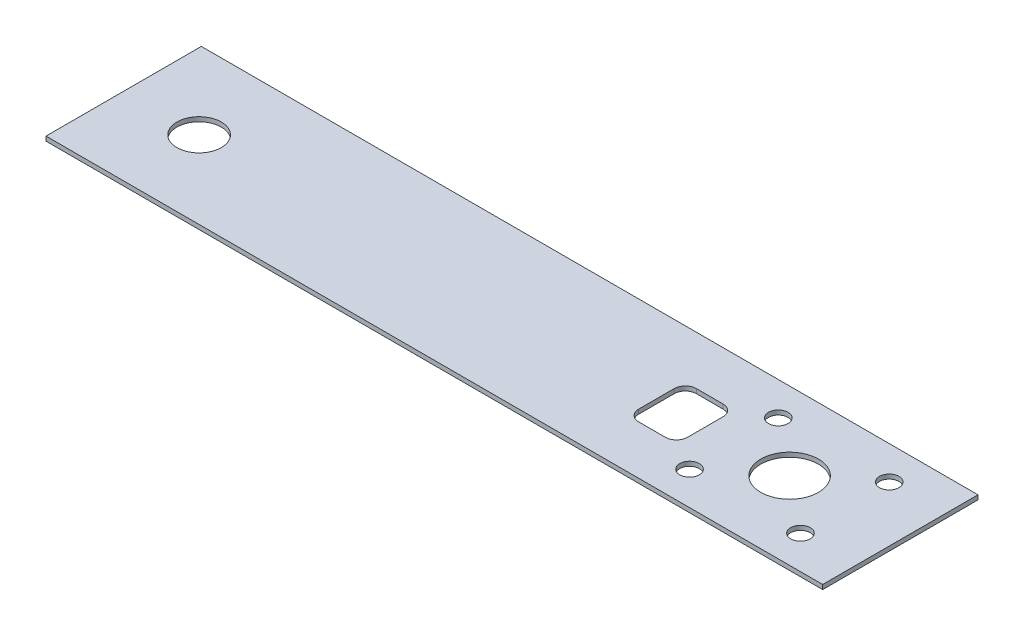
ISO-10303-21;
HEADER;
FILE_DESCRIPTION(('STEP AP214'),'2;1');
FILE_NAME('part.step','',(''),(''),'','','');
FILE_SCHEMA(('AUTOMOTIVE_DESIGN { 1 0 10303 214 1 1 1 1 }'));
ENDSEC;
DATA;
#1=APPLICATION_CONTEXT('core data for automotive mechanical design processes');
#2=APPLICATION_PROTOCOL_DEFINITION('international standard','automotive_design',2000,#1);
#3=PRODUCT_CONTEXT('',#1,'mechanical');
#4=PRODUCT('Part','Part','',(#3));
#5=PRODUCT_RELATED_PRODUCT_CATEGORY('part','',(#4));
#6=PRODUCT_DEFINITION_FORMATION('','',#4);
#7=PRODUCT_DEFINITION_CONTEXT('part definition',#1,'design');
#8=PRODUCT_DEFINITION('design','',#6,#7);
#9=PRODUCT_DEFINITION_SHAPE('','',#8);
#10=(LENGTH_UNIT() NAMED_UNIT(*) SI_UNIT(.MILLI.,.METRE.));
#11=(NAMED_UNIT(*) PLANE_ANGLE_UNIT() SI_UNIT($,.RADIAN.));
#12=(NAMED_UNIT(*) SI_UNIT($,.STERADIAN.) SOLID_ANGLE_UNIT());
#13=UNCERTAINTY_MEASURE_WITH_UNIT(LENGTH_MEASURE(1.E-05),#10,'distance_accuracy_value','');
#14=(GEOMETRIC_REPRESENTATION_CONTEXT(3) GLOBAL_UNCERTAINTY_ASSIGNED_CONTEXT((#13)) GLOBAL_UNIT_ASSIGNED_CONTEXT((#10,
#11,#12)) REPRESENTATION_CONTEXT('',''));
#15=CARTESIAN_POINT('',(0.,0.,0.));
#16=DIRECTION('',(0.,0.,1.));
#17=DIRECTION('',(1.,0.,0.));
#18=AXIS2_PLACEMENT_3D('',#15,#16,#17);
#19=CARTESIAN_POINT('',(0.,2.,0.));
#20=DIRECTION('',(0.,-1.,0.));
#21=DIRECTION('',(0.,0.,-1.));
#22=AXIS2_PLACEMENT_3D('',#19,#20,#21);
#23=PLANE('',#22);
#24=CARTESIAN_POINT('',(-141.,2.,0.));
#25=DIRECTION('',(0.,-1.,0.));
#26=DIRECTION('',(0.,0.,-1.));
#27=AXIS2_PLACEMENT_3D('',#24,#25,#26);
#28=CIRCLE('',#27,10.);
#29=CARTESIAN_POINT('',(-141.,2.,-10.));
#30=VERTEX_POINT('',#29);
#31=EDGE_CURVE('E321',#30,#30,#28,.T.);
#32=ORIENTED_EDGE('',*,*,#31,.T.);
#33=EDGE_LOOP('',(#32));
#34=FACE_BOUND('',#33,.T.);
#35=CARTESIAN_POINT('',(125.1,2.,0.));
#36=DIRECTION('',(0.,-1.,0.));
#37=DIRECTION('',(0.,0.,-1.));
#38=AXIS2_PLACEMENT_3D('',#35,#36,#37);
#39=CIRCLE('',#38,13.);
#40=CARTESIAN_POINT('',(125.1,2.,-13.));
#41=VERTEX_POINT('',#40);
#42=EDGE_CURVE('E313',#41,#41,#39,.T.);
#43=ORIENTED_EDGE('',*,*,#42,.T.);
#44=EDGE_LOOP('',(#43));
#45=FACE_BOUND('',#44,.T.);
#46=CARTESIAN_POINT('',(100.,2.,-20.0000000000135));
#47=DIRECTION('',(0.,1.,0.));
#48=DIRECTION('',(0.,0.,-1.));
#49=AXIS2_PLACEMENT_3D('',#46,#47,#48);
#50=CIRCLE('',#49,4.40000000000002);
#51=CARTESIAN_POINT('',(100.,2.,-24.4000000000135));
#52=VERTEX_POINT('',#51);
#53=EDGE_CURVE('E269',#52,#52,#50,.T.);
#54=ORIENTED_EDGE('',*,*,#53,.F.);
#55=EDGE_LOOP('',(#54));
#56=FACE_BOUND('',#55,.T.);
#57=CARTESIAN_POINT('',(100.,2.,19.9999999999872));
#58=DIRECTION('',(0.,1.,0.));
#59=DIRECTION('',(0.,0.,1.));
#60=AXIS2_PLACEMENT_3D('',#57,#58,#59);
#61=CIRCLE('',#60,4.40000000000002);
#62=CARTESIAN_POINT('',(100.,2.,24.3999999999873));
#63=VERTEX_POINT('',#62);
#64=EDGE_CURVE('E261',#63,#63,#61,.T.);
#65=ORIENTED_EDGE('',*,*,#64,.F.);
#66=EDGE_LOOP('',(#65));
#67=FACE_BOUND('',#66,.T.);
#68=CARTESIAN_POINT('',(150.,2.,19.9999999999872));
#69=DIRECTION('',(0.,1.,0.));
#70=DIRECTION('',(0.,0.,-1.));
#71=AXIS2_PLACEMENT_3D('',#68,#69,#70);
#72=CIRCLE('',#71,4.40000000000002);
#73=CARTESIAN_POINT('',(150.,2.,15.5999999999872));
#74=VERTEX_POINT('',#73);
#75=EDGE_CURVE('E260',#74,#74,#72,.T.);
#76=ORIENTED_EDGE('',*,*,#75,.F.);
#77=EDGE_LOOP('',(#76));
#78=FACE_BOUND('',#77,.T.);
#79=CARTESIAN_POINT('',(150.,2.,-20.0000000000135));
#80=DIRECTION('',(0.,1.,0.));
#81=DIRECTION('',(0.,0.,1.));
#82=AXIS2_PLACEMENT_3D('',#79,#80,#81);
#83=CIRCLE('',#82,4.40000000000002);
#84=CARTESIAN_POINT('',(150.,2.,-15.6000000000135));
#85=VERTEX_POINT('',#84);
#86=EDGE_CURVE('E207',#85,#85,#83,.T.);
#87=ORIENTED_EDGE('',*,*,#86,.F.);
#88=EDGE_LOOP('',(#87));
#89=FACE_BOUND('',#88,.T.);
#90=DIRECTION('',(0.,0.,-1.));
#91=VECTOR('',#90,1.);
#92=CARTESIAN_POINT('',(175.,2.,35.));
#93=LINE('',#92,#91);
#94=CARTESIAN_POINT('',(175.,2.,35.));
#95=VERTEX_POINT('',#94);
#96=CARTESIAN_POINT('',(175.,2.,-35.));
#97=VERTEX_POINT('',#96);
#98=EDGE_CURVE('E213',#95,#97,#93,.T.);
#99=ORIENTED_EDGE('',*,*,#98,.T.);
#100=DIRECTION('',(-1.,0.,0.));
#101=VECTOR('',#100,1.);
#102=CARTESIAN_POINT('',(-175.,2.,-35.));
#103=LINE('',#102,#101);
#104=CARTESIAN_POINT('',(-175.,2.,-35.));
#105=VERTEX_POINT('',#104);
#106=EDGE_CURVE('E241',#97,#105,#103,.T.);
#107=ORIENTED_EDGE('',*,*,#106,.T.);
#108=DIRECTION('',(0.,0.,1.));
#109=VECTOR('',#108,1.);
#110=CARTESIAN_POINT('',(-175.,2.,35.));
#111=LINE('',#110,#109);
#112=CARTESIAN_POINT('',(-175.,2.,35.));
#113=VERTEX_POINT('',#112);
#114=EDGE_CURVE('E200',#105,#113,#111,.T.);
#115=ORIENTED_EDGE('',*,*,#114,.T.);
#116=DIRECTION('',(1.,0.,0.));
#117=VECTOR('',#116,1.);
#118=CARTESIAN_POINT('',(-175.,2.,35.));
#119=LINE('',#118,#117);
#120=EDGE_CURVE('E195',#113,#95,#119,.T.);
#121=ORIENTED_EDGE('',*,*,#120,.T.);
#122=EDGE_LOOP('',(#99,#107,#115,#121));
#123=FACE_BOUND('',#122,.T.);
#124=CARTESIAN_POINT('',(70.0999999999999,2.,8.00000000001254));
#125=DIRECTION('',(0.,1.,0.));
#126=DIRECTION('',(0.,0.,-1.));
#127=AXIS2_PLACEMENT_3D('',#124,#125,#126);
#128=CIRCLE('',#127,5.);
#129=CARTESIAN_POINT('',(65.0999999999999,2.,8.0000000000125));
#130=VERTEX_POINT('',#129);
#131=CARTESIAN_POINT('',(70.0999999999999,2.,13.0000000000125));
#132=VERTEX_POINT('',#131);
#133=EDGE_CURVE('E135',#130,#132,#128,.T.);
#134=ORIENTED_EDGE('',*,*,#133,.F.);
#135=DIRECTION('',(0.,0.,1.));
#136=VECTOR('',#135,1.);
#137=CARTESIAN_POINT('',(65.0999999999999,2.,8.0000000000125));
#138=LINE('',#137,#136);
#139=CARTESIAN_POINT('',(65.0999999999999,2.,-8.0000000000125));
#140=VERTEX_POINT('',#139);
#141=EDGE_CURVE('E185',#140,#130,#138,.T.);
#142=ORIENTED_EDGE('',*,*,#141,.F.);
#143=CARTESIAN_POINT('',(70.0999999999999,2.,-8.00000000001254));
#144=DIRECTION('',(0.,1.,0.));
#145=DIRECTION('',(0.,0.,1.));
#146=AXIS2_PLACEMENT_3D('',#143,#144,#145);
#147=CIRCLE('',#146,5.);
#148=CARTESIAN_POINT('',(70.0999999999999,2.,-13.0000000000125));
#149=VERTEX_POINT('',#148);
#150=EDGE_CURVE('E181',#149,#140,#147,.T.);
#151=ORIENTED_EDGE('',*,*,#150,.F.);
#152=DIRECTION('',(-1.,0.,0.));
#153=VECTOR('',#152,1.);
#154=CARTESIAN_POINT('',(82.1000000000001,2.,-13.0000000000125));
#155=LINE('',#154,#153);
#156=CARTESIAN_POINT('',(82.1000000000001,2.,-13.0000000000125));
#157=VERTEX_POINT('',#156);
#158=EDGE_CURVE('E177',#157,#149,#155,.T.);
#159=ORIENTED_EDGE('',*,*,#158,.F.);
#160=CARTESIAN_POINT('',(82.1000000000001,2.,-8.00000000001254));
#161=DIRECTION('',(0.,1.,0.));
#162=DIRECTION('',(0.,0.,1.));
#163=AXIS2_PLACEMENT_3D('',#160,#161,#162);
#164=CIRCLE('',#163,5.);
#165=CARTESIAN_POINT('',(87.1000000000001,2.,-8.0000000000125));
#166=VERTEX_POINT('',#165);
#167=EDGE_CURVE('E174',#166,#157,#164,.T.);
#168=ORIENTED_EDGE('',*,*,#167,.F.);
#169=DIRECTION('',(0.,0.,-1.));
#170=VECTOR('',#169,1.);
#171=CARTESIAN_POINT('',(87.1000000000001,2.,8.0000000000125));
#172=LINE('',#171,#170);
#173=CARTESIAN_POINT('',(87.1000000000001,2.,8.00000000001251));
#174=VERTEX_POINT('',#173);
#175=EDGE_CURVE('E160',#174,#166,#172,.T.);
#176=ORIENTED_EDGE('',*,*,#175,.F.);
#177=CARTESIAN_POINT('',(82.1000000000001,2.,8.00000000001254));
#178=DIRECTION('',(0.,1.,0.));
#179=DIRECTION('',(0.,0.,1.));
#180=AXIS2_PLACEMENT_3D('',#177,#178,#179);
#181=CIRCLE('',#180,5.);
#182=CARTESIAN_POINT('',(82.1000000000001,2.,13.0000000000125));
#183=VERTEX_POINT('',#182);
#184=EDGE_CURVE('E157',#183,#174,#181,.T.);
#185=ORIENTED_EDGE('',*,*,#184,.F.);
#186=DIRECTION('',(1.,0.,0.));
#187=VECTOR('',#186,1.);
#188=CARTESIAN_POINT('',(82.1000000000001,2.,13.0000000000125));
#189=LINE('',#188,#187);
#190=EDGE_CURVE('E144',#132,#183,#189,.T.);
#191=ORIENTED_EDGE('',*,*,#190,.F.);
#192=EDGE_LOOP('',(#134,#142,#151,#159,#168,#176,#185,#191));
#193=FACE_BOUND('',#192,.T.);
#194=ADVANCED_FACE('F46',(#34,#45,#56,#67,#78,#89,#123,#193),#23,.F.);
#195=CARTESIAN_POINT('',(0.,0.,0.));
#196=DIRECTION('',(0.,-1.,0.));
#197=DIRECTION('',(0.,0.,-1.));
#198=AXIS2_PLACEMENT_3D('',#195,#196,#197);
#199=PLANE('',#198);
#200=CARTESIAN_POINT('',(-141.,0.,0.));
#201=DIRECTION('',(0.,1.,0.));
#202=DIRECTION('',(0.,0.,1.));
#203=AXIS2_PLACEMENT_3D('',#200,#201,#202);
#204=CIRCLE('',#203,10.);
#205=CARTESIAN_POINT('',(-141.,0.,10.));
#206=VERTEX_POINT('',#205);
#207=EDGE_CURVE('E319',#206,#206,#204,.T.);
#208=ORIENTED_EDGE('',*,*,#207,.T.);
#209=EDGE_LOOP('',(#208));
#210=FACE_BOUND('',#209,.T.);
#211=CARTESIAN_POINT('',(125.1,0.,0.));
#212=DIRECTION('',(0.,1.,0.));
#213=DIRECTION('',(0.,0.,1.));
#214=AXIS2_PLACEMENT_3D('',#211,#212,#213);
#215=CIRCLE('',#214,13.);
#216=CARTESIAN_POINT('',(125.1,0.,13.));
#217=VERTEX_POINT('',#216);
#218=EDGE_CURVE('E310',#217,#217,#215,.T.);
#219=ORIENTED_EDGE('',*,*,#218,.T.);
#220=EDGE_LOOP('',(#219));
#221=FACE_BOUND('',#220,.T.);
#222=CARTESIAN_POINT('',(100.,0.,19.9999999999872));
#223=DIRECTION('',(0.,1.,0.));
#224=DIRECTION('',(0.,0.,1.));
#225=AXIS2_PLACEMENT_3D('',#222,#223,#224);
#226=CIRCLE('',#225,4.40000000000002);
#227=CARTESIAN_POINT('',(100.,0.,24.3999999999873));
#228=VERTEX_POINT('',#227);
#229=EDGE_CURVE('E266',#228,#228,#226,.T.);
#230=ORIENTED_EDGE('',*,*,#229,.T.);
#231=EDGE_LOOP('',(#230));
#232=FACE_BOUND('',#231,.T.);
#233=CARTESIAN_POINT('',(150.,0.,-20.0000000000135));
#234=DIRECTION('',(0.,1.,0.));
#235=DIRECTION('',(0.,0.,1.));
#236=AXIS2_PLACEMENT_3D('',#233,#234,#235);
#237=CIRCLE('',#236,4.40000000000002);
#238=CARTESIAN_POINT('',(150.,0.,-15.6000000000135));
#239=VERTEX_POINT('',#238);
#240=EDGE_CURVE('E247',#239,#239,#237,.T.);
#241=ORIENTED_EDGE('',*,*,#240,.T.);
#242=EDGE_LOOP('',(#241));
#243=FACE_BOUND('',#242,.T.);
#244=DIRECTION('',(0.,0.,-1.));
#245=VECTOR('',#244,1.);
#246=CARTESIAN_POINT('',(175.,0.,35.));
#247=LINE('',#246,#245);
#248=CARTESIAN_POINT('',(175.,0.,35.));
#249=VERTEX_POINT('',#248);
#250=CARTESIAN_POINT('',(175.,0.,-35.));
#251=VERTEX_POINT('',#250);
#252=EDGE_CURVE('E203',#249,#251,#247,.T.);
#253=ORIENTED_EDGE('',*,*,#252,.F.);
#254=DIRECTION('',(1.,0.,0.));
#255=VECTOR('',#254,1.);
#256=CARTESIAN_POINT('',(-175.,0.,35.));
#257=LINE('',#256,#255);
#258=CARTESIAN_POINT('',(-175.,0.,35.));
#259=VERTEX_POINT('',#258);
#260=EDGE_CURVE('E211',#259,#249,#257,.T.);
#261=ORIENTED_EDGE('',*,*,#260,.F.);
#262=DIRECTION('',(0.,0.,1.));
#263=VECTOR('',#262,1.);
#264=CARTESIAN_POINT('',(-175.,0.,35.));
#265=LINE('',#264,#263);
#266=CARTESIAN_POINT('',(-175.,0.,-35.));
#267=VERTEX_POINT('',#266);
#268=EDGE_CURVE('E209',#267,#259,#265,.T.);
#269=ORIENTED_EDGE('',*,*,#268,.F.);
#270=DIRECTION('',(-1.,0.,0.));
#271=VECTOR('',#270,1.);
#272=CARTESIAN_POINT('',(-175.,0.,-35.));
#273=LINE('',#272,#271);
#274=EDGE_CURVE('E206',#251,#267,#273,.T.);
#275=ORIENTED_EDGE('',*,*,#274,.F.);
#276=EDGE_LOOP('',(#253,#261,#269,#275));
#277=FACE_BOUND('',#276,.T.);
#278=CARTESIAN_POINT('',(150.,0.,19.9999999999872));
#279=DIRECTION('',(0.,1.,0.));
#280=DIRECTION('',(0.,0.,-1.));
#281=AXIS2_PLACEMENT_3D('',#278,#279,#280);
#282=CIRCLE('',#281,4.40000000000002);
#283=CARTESIAN_POINT('',(150.,0.,15.5999999999872));
#284=VERTEX_POINT('',#283);
#285=EDGE_CURVE('E258',#284,#284,#282,.T.);
#286=ORIENTED_EDGE('',*,*,#285,.T.);
#287=EDGE_LOOP('',(#286));
#288=FACE_BOUND('',#287,.T.);
#289=CARTESIAN_POINT('',(100.,0.,-20.0000000000135));
#290=DIRECTION('',(0.,1.,0.));
#291=DIRECTION('',(0.,0.,-1.));
#292=AXIS2_PLACEMENT_3D('',#289,#290,#291);
#293=CIRCLE('',#292,4.40000000000002);
#294=CARTESIAN_POINT('',(100.,0.,-24.4000000000135));
#295=VERTEX_POINT('',#294);
#296=EDGE_CURVE('E152',#295,#295,#293,.T.);
#297=ORIENTED_EDGE('',*,*,#296,.T.);
#298=EDGE_LOOP('',(#297));
#299=FACE_BOUND('',#298,.T.);
#300=DIRECTION('',(0.,0.,1.));
#301=VECTOR('',#300,1.);
#302=CARTESIAN_POINT('',(65.0999999999999,0.,8.0000000000125));
#303=LINE('',#302,#301);
#304=CARTESIAN_POINT('',(65.0999999999999,0.,-8.0000000000125));
#305=VERTEX_POINT('',#304);
#306=CARTESIAN_POINT('',(65.0999999999999,0.,8.0000000000125));
#307=VERTEX_POINT('',#306);
#308=EDGE_CURVE('E145',#305,#307,#303,.T.);
#309=ORIENTED_EDGE('',*,*,#308,.T.);
#310=CARTESIAN_POINT('',(70.0999999999999,0.,8.00000000001254));
#311=DIRECTION('',(0.,1.,0.));
#312=DIRECTION('',(0.,0.,-1.));
#313=AXIS2_PLACEMENT_3D('',#310,#311,#312);
#314=CIRCLE('',#313,5.);
#315=CARTESIAN_POINT('',(70.0999999999999,0.,13.0000000000125));
#316=VERTEX_POINT('',#315);
#317=EDGE_CURVE('E69',#307,#316,#314,.T.);
#318=ORIENTED_EDGE('',*,*,#317,.T.);
#319=DIRECTION('',(1.,0.,0.));
#320=VECTOR('',#319,1.);
#321=CARTESIAN_POINT('',(82.1000000000001,0.,13.0000000000125));
#322=LINE('',#321,#320);
#323=CARTESIAN_POINT('',(82.1000000000001,0.,13.0000000000125));
#324=VERTEX_POINT('',#323);
#325=EDGE_CURVE('E151',#316,#324,#322,.T.);
#326=ORIENTED_EDGE('',*,*,#325,.T.);
#327=CARTESIAN_POINT('',(82.1000000000001,0.,8.00000000001254));
#328=DIRECTION('',(0.,1.,0.));
#329=DIRECTION('',(0.,0.,1.));
#330=AXIS2_PLACEMENT_3D('',#327,#328,#329);
#331=CIRCLE('',#330,5.);
#332=CARTESIAN_POINT('',(87.1000000000001,0.,8.00000000001251));
#333=VERTEX_POINT('',#332);
#334=EDGE_CURVE('E307',#324,#333,#331,.T.);
#335=ORIENTED_EDGE('',*,*,#334,.T.);
#336=DIRECTION('',(0.,0.,-1.));
#337=VECTOR('',#336,1.);
#338=CARTESIAN_POINT('',(87.1000000000001,0.,8.0000000000125));
#339=LINE('',#338,#337);
#340=CARTESIAN_POINT('',(87.1000000000001,0.,-8.0000000000125));
#341=VERTEX_POINT('',#340);
#342=EDGE_CURVE('E304',#333,#341,#339,.T.);
#343=ORIENTED_EDGE('',*,*,#342,.T.);
#344=CARTESIAN_POINT('',(82.1000000000001,0.,-8.00000000001254));
#345=DIRECTION('',(0.,1.,0.));
#346=DIRECTION('',(0.,0.,1.));
#347=AXIS2_PLACEMENT_3D('',#344,#345,#346);
#348=CIRCLE('',#347,5.);
#349=CARTESIAN_POINT('',(82.1000000000001,0.,-13.0000000000125));
#350=VERTEX_POINT('',#349);
#351=EDGE_CURVE('E301',#341,#350,#348,.T.);
#352=ORIENTED_EDGE('',*,*,#351,.T.);
#353=DIRECTION('',(-1.,0.,0.));
#354=VECTOR('',#353,1.);
#355=CARTESIAN_POINT('',(82.1000000000001,0.,-13.0000000000125));
#356=LINE('',#355,#354);
#357=CARTESIAN_POINT('',(70.0999999999999,0.,-13.0000000000125));
#358=VERTEX_POINT('',#357);
#359=EDGE_CURVE('E298',#350,#358,#356,.T.);
#360=ORIENTED_EDGE('',*,*,#359,.T.);
#361=CARTESIAN_POINT('',(70.0999999999999,0.,-8.00000000001254));
#362=DIRECTION('',(0.,1.,0.));
#363=DIRECTION('',(0.,0.,1.));
#364=AXIS2_PLACEMENT_3D('',#361,#362,#363);
#365=CIRCLE('',#364,5.);
#366=EDGE_CURVE('E295',#358,#305,#365,.T.);
#367=ORIENTED_EDGE('',*,*,#366,.T.);
#368=EDGE_LOOP('',(#309,#318,#326,#335,#343,#352,#360,#367));
#369=FACE_BOUND('',#368,.T.);
#370=ADVANCED_FACE('F229',(#210,#221,#232,#243,#277,#288,#299,#369),#199,.T.);
#371=CARTESIAN_POINT('',(175.,2.,35.));
#372=DIRECTION('',(-1.,0.,0.));
#373=DIRECTION('',(0.,0.,1.));
#374=AXIS2_PLACEMENT_3D('',#371,#372,#373);
#375=PLANE('',#374);
#376=ORIENTED_EDGE('',*,*,#252,.T.);
#377=DIRECTION('',(0.,-1.,0.));
#378=VECTOR('',#377,1.);
#379=CARTESIAN_POINT('',(175.,2.,-35.));
#380=LINE('',#379,#378);
#381=EDGE_CURVE('E12',#97,#251,#380,.T.);
#382=ORIENTED_EDGE('',*,*,#381,.F.);
#383=ORIENTED_EDGE('',*,*,#98,.F.);
#384=DIRECTION('',(0.,-1.,0.));
#385=VECTOR('',#384,1.);
#386=CARTESIAN_POINT('',(175.,2.,35.));
#387=LINE('',#386,#385);
#388=EDGE_CURVE('E199',#95,#249,#387,.T.);
#389=ORIENTED_EDGE('',*,*,#388,.T.);
#390=EDGE_LOOP('',(#376,#382,#383,#389));
#391=FACE_BOUND('',#390,.T.);
#392=ADVANCED_FACE('F48',(#391),#375,.F.);
#393=CARTESIAN_POINT('',(-175.,2.,-35.));
#394=DIRECTION('',(0.,0.,1.));
#395=DIRECTION('',(1.,0.,0.));
#396=AXIS2_PLACEMENT_3D('',#393,#394,#395);
#397=PLANE('',#396);
#398=ORIENTED_EDGE('',*,*,#274,.T.);
#399=DIRECTION('',(0.,-1.,0.));
#400=VECTOR('',#399,1.);
#401=CARTESIAN_POINT('',(-175.,2.,-35.));
#402=LINE('',#401,#400);
#403=EDGE_CURVE('E54',#105,#267,#402,.T.);
#404=ORIENTED_EDGE('',*,*,#403,.F.);
#405=ORIENTED_EDGE('',*,*,#106,.F.);
#406=ORIENTED_EDGE('',*,*,#381,.T.);
#407=EDGE_LOOP('',(#398,#404,#405,#406));
#408=FACE_BOUND('',#407,.T.);
#409=ADVANCED_FACE('F364',(#408),#397,.F.);
#410=CARTESIAN_POINT('',(-175.,2.,35.));
#411=DIRECTION('',(1.,0.,0.));
#412=DIRECTION('',(0.,0.,-1.));
#413=AXIS2_PLACEMENT_3D('',#410,#411,#412);
#414=PLANE('',#413);
#415=ORIENTED_EDGE('',*,*,#268,.T.);
#416=DIRECTION('',(0.,-1.,0.));
#417=VECTOR('',#416,1.);
#418=CARTESIAN_POINT('',(-175.,2.,35.));
#419=LINE('',#418,#417);
#420=EDGE_CURVE('E216',#113,#259,#419,.T.);
#421=ORIENTED_EDGE('',*,*,#420,.F.);
#422=ORIENTED_EDGE('',*,*,#114,.F.);
#423=ORIENTED_EDGE('',*,*,#403,.T.);
#424=EDGE_LOOP('',(#415,#421,#422,#423));
#425=FACE_BOUND('',#424,.T.);
#426=ADVANCED_FACE('F223',(#425),#414,.F.);
#427=CARTESIAN_POINT('',(-175.,2.,35.));
#428=DIRECTION('',(0.,0.,-1.));
#429=DIRECTION('',(-1.,0.,0.));
#430=AXIS2_PLACEMENT_3D('',#427,#428,#429);
#431=PLANE('',#430);
#432=ORIENTED_EDGE('',*,*,#260,.T.);
#433=ORIENTED_EDGE('',*,*,#388,.F.);
#434=ORIENTED_EDGE('',*,*,#120,.F.);
#435=ORIENTED_EDGE('',*,*,#420,.T.);
#436=EDGE_LOOP('',(#432,#433,#434,#435));
#437=FACE_BOUND('',#436,.T.);
#438=ADVANCED_FACE('F233',(#437),#431,.F.);
#439=CARTESIAN_POINT('',(150.,2.,-20.0000000000135));
#440=DIRECTION('',(0.,-1.,0.));
#441=DIRECTION('',(0.,0.,-1.));
#442=AXIS2_PLACEMENT_3D('',#439,#440,#441);
#443=CYLINDRICAL_SURFACE('',#442,4.40000000000002);
#444=ORIENTED_EDGE('',*,*,#86,.T.);
#445=EDGE_LOOP('',(#444));
#446=FACE_BOUND('',#445,.T.);
#447=ORIENTED_EDGE('',*,*,#240,.F.);
#448=EDGE_LOOP('',(#447));
#449=FACE_BOUND('',#448,.T.);
#450=ADVANCED_FACE('F351',(#446,#449),#443,.F.);
#451=CARTESIAN_POINT('',(150.,2.,19.9999999999872));
#452=DIRECTION('',(0.,-1.,0.));
#453=DIRECTION('',(0.,0.,-1.));
#454=AXIS2_PLACEMENT_3D('',#451,#452,#453);
#455=CYLINDRICAL_SURFACE('',#454,4.40000000000002);
#456=ORIENTED_EDGE('',*,*,#75,.T.);
#457=EDGE_LOOP('',(#456));
#458=FACE_BOUND('',#457,.T.);
#459=ORIENTED_EDGE('',*,*,#285,.F.);
#460=EDGE_LOOP('',(#459));
#461=FACE_BOUND('',#460,.T.);
#462=ADVANCED_FACE('F354',(#458,#461),#455,.F.);
#463=CARTESIAN_POINT('',(100.,2.,19.9999999999872));
#464=DIRECTION('',(0.,-1.,0.));
#465=DIRECTION('',(0.,0.,-1.));
#466=AXIS2_PLACEMENT_3D('',#463,#464,#465);
#467=CYLINDRICAL_SURFACE('',#466,4.40000000000002);
#468=ORIENTED_EDGE('',*,*,#64,.T.);
#469=EDGE_LOOP('',(#468));
#470=FACE_BOUND('',#469,.T.);
#471=ORIENTED_EDGE('',*,*,#229,.F.);
#472=EDGE_LOOP('',(#471));
#473=FACE_BOUND('',#472,.T.);
#474=ADVANCED_FACE('F412',(#470,#473),#467,.F.);
#475=CARTESIAN_POINT('',(100.,2.,-20.0000000000135));
#476=DIRECTION('',(0.,-1.,0.));
#477=DIRECTION('',(0.,0.,-1.));
#478=AXIS2_PLACEMENT_3D('',#475,#476,#477);
#479=CYLINDRICAL_SURFACE('',#478,4.40000000000002);
#480=ORIENTED_EDGE('',*,*,#53,.T.);
#481=EDGE_LOOP('',(#480));
#482=FACE_BOUND('',#481,.T.);
#483=ORIENTED_EDGE('',*,*,#296,.F.);
#484=EDGE_LOOP('',(#483));
#485=FACE_BOUND('',#484,.T.);
#486=ADVANCED_FACE('F409',(#482,#485),#479,.F.);
#487=CARTESIAN_POINT('',(70.0999999999999,2.,8.00000000001254));
#488=DIRECTION('',(0.,-1.,0.));
#489=DIRECTION('',(0.,0.,-1.));
#490=AXIS2_PLACEMENT_3D('',#487,#488,#489);
#491=CYLINDRICAL_SURFACE('',#490,5.);
#492=ORIENTED_EDGE('',*,*,#317,.F.);
#493=DIRECTION('',(0.,-1.,0.));
#494=VECTOR('',#493,1.);
#495=CARTESIAN_POINT('',(65.0999999999999,2.,8.0000000000125));
#496=LINE('',#495,#494);
#497=EDGE_CURVE('E139',#130,#307,#496,.T.);
#498=ORIENTED_EDGE('',*,*,#497,.F.);
#499=ORIENTED_EDGE('',*,*,#133,.T.);
#500=DIRECTION('',(0.,-1.,0.));
#501=VECTOR('',#500,1.);
#502=CARTESIAN_POINT('',(70.0999999999999,2.,13.0000000000125));
#503=LINE('',#502,#501);
#504=EDGE_CURVE('E138',#132,#316,#503,.T.);
#505=ORIENTED_EDGE('',*,*,#504,.T.);
#506=EDGE_LOOP('',(#492,#498,#499,#505));
#507=FACE_BOUND('',#506,.T.);
#508=ADVANCED_FACE('F137',(#507),#491,.F.);
#509=CARTESIAN_POINT('',(82.1000000000001,2.,13.0000000000125));
#510=DIRECTION('',(0.,0.,-1.));
#511=DIRECTION('',(-1.,0.,0.));
#512=AXIS2_PLACEMENT_3D('',#509,#510,#511);
#513=PLANE('',#512);
#514=ORIENTED_EDGE('',*,*,#325,.F.);
#515=ORIENTED_EDGE('',*,*,#504,.F.);
#516=ORIENTED_EDGE('',*,*,#190,.T.);
#517=DIRECTION('',(0.,-1.,0.));
#518=VECTOR('',#517,1.);
#519=CARTESIAN_POINT('',(82.1000000000001,2.,13.0000000000125));
#520=LINE('',#519,#518);
#521=EDGE_CURVE('E153',#183,#324,#520,.T.);
#522=ORIENTED_EDGE('',*,*,#521,.T.);
#523=EDGE_LOOP('',(#514,#515,#516,#522));
#524=FACE_BOUND('',#523,.T.);
#525=ADVANCED_FACE('F148',(#524),#513,.T.);
#526=CARTESIAN_POINT('',(82.1000000000001,2.,8.00000000001254));
#527=DIRECTION('',(0.,-1.,0.));
#528=DIRECTION('',(0.,0.,-1.));
#529=AXIS2_PLACEMENT_3D('',#526,#527,#528);
#530=CYLINDRICAL_SURFACE('',#529,5.);
#531=ORIENTED_EDGE('',*,*,#334,.F.);
#532=ORIENTED_EDGE('',*,*,#521,.F.);
#533=ORIENTED_EDGE('',*,*,#184,.T.);
#534=DIRECTION('',(0.,-1.,0.));
#535=VECTOR('',#534,1.);
#536=CARTESIAN_POINT('',(87.1000000000001,2.,8.00000000001251));
#537=LINE('',#536,#535);
#538=EDGE_CURVE('E283',#174,#333,#537,.T.);
#539=ORIENTED_EDGE('',*,*,#538,.T.);
#540=EDGE_LOOP('',(#531,#532,#533,#539));
#541=FACE_BOUND('',#540,.T.);
#542=ADVANCED_FACE('F396',(#541),#530,.F.);
#543=CARTESIAN_POINT('',(87.1000000000001,2.,8.0000000000125));
#544=DIRECTION('',(-1.,0.,0.));
#545=DIRECTION('',(0.,0.,1.));
#546=AXIS2_PLACEMENT_3D('',#543,#544,#545);
#547=PLANE('',#546);
#548=ORIENTED_EDGE('',*,*,#342,.F.);
#549=ORIENTED_EDGE('',*,*,#538,.F.);
#550=ORIENTED_EDGE('',*,*,#175,.T.);
#551=DIRECTION('',(0.,-1.,0.));
#552=VECTOR('',#551,1.);
#553=CARTESIAN_POINT('',(87.1000000000001,2.,-8.0000000000125));
#554=LINE('',#553,#552);
#555=EDGE_CURVE('E285',#166,#341,#554,.T.);
#556=ORIENTED_EDGE('',*,*,#555,.T.);
#557=EDGE_LOOP('',(#548,#549,#550,#556));
#558=FACE_BOUND('',#557,.T.);
#559=ADVANCED_FACE('F379',(#558),#547,.T.);
#560=CARTESIAN_POINT('',(82.1000000000001,2.,-8.00000000001254));
#561=DIRECTION('',(0.,-1.,0.));
#562=DIRECTION('',(0.,0.,-1.));
#563=AXIS2_PLACEMENT_3D('',#560,#561,#562);
#564=CYLINDRICAL_SURFACE('',#563,5.);
#565=ORIENTED_EDGE('',*,*,#351,.F.);
#566=ORIENTED_EDGE('',*,*,#555,.F.);
#567=ORIENTED_EDGE('',*,*,#167,.T.);
#568=DIRECTION('',(0.,-1.,0.));
#569=VECTOR('',#568,1.);
#570=CARTESIAN_POINT('',(82.1000000000001,2.,-13.0000000000125));
#571=LINE('',#570,#569);
#572=EDGE_CURVE('E287',#157,#350,#571,.T.);
#573=ORIENTED_EDGE('',*,*,#572,.T.);
#574=EDGE_LOOP('',(#565,#566,#567,#573));
#575=FACE_BOUND('',#574,.T.);
#576=ADVANCED_FACE('F383',(#575),#564,.F.);
#577=CARTESIAN_POINT('',(82.1000000000001,2.,-13.0000000000125));
#578=DIRECTION('',(0.,0.,1.));
#579=DIRECTION('',(1.,0.,0.));
#580=AXIS2_PLACEMENT_3D('',#577,#578,#579);
#581=PLANE('',#580);
#582=ORIENTED_EDGE('',*,*,#359,.F.);
#583=ORIENTED_EDGE('',*,*,#572,.F.);
#584=ORIENTED_EDGE('',*,*,#158,.T.);
#585=DIRECTION('',(0.,-1.,0.));
#586=VECTOR('',#585,1.);
#587=CARTESIAN_POINT('',(70.0999999999999,2.,-13.0000000000125));
#588=LINE('',#587,#586);
#589=EDGE_CURVE('E289',#149,#358,#588,.T.);
#590=ORIENTED_EDGE('',*,*,#589,.T.);
#591=EDGE_LOOP('',(#582,#583,#584,#590));
#592=FACE_BOUND('',#591,.T.);
#593=ADVANCED_FACE('F390',(#592),#581,.T.);
#594=CARTESIAN_POINT('',(70.0999999999999,2.,-8.00000000001254));
#595=DIRECTION('',(0.,-1.,0.));
#596=DIRECTION('',(0.,0.,-1.));
#597=AXIS2_PLACEMENT_3D('',#594,#595,#596);
#598=CYLINDRICAL_SURFACE('',#597,5.);
#599=ORIENTED_EDGE('',*,*,#366,.F.);
#600=ORIENTED_EDGE('',*,*,#589,.F.);
#601=ORIENTED_EDGE('',*,*,#150,.T.);
#602=DIRECTION('',(0.,-1.,0.));
#603=VECTOR('',#602,1.);
#604=CARTESIAN_POINT('',(65.0999999999999,2.,-8.0000000000125));
#605=LINE('',#604,#603);
#606=EDGE_CURVE('E61',#140,#305,#605,.T.);
#607=ORIENTED_EDGE('',*,*,#606,.T.);
#608=EDGE_LOOP('',(#599,#600,#601,#607));
#609=FACE_BOUND('',#608,.T.);
#610=ADVANCED_FACE('F393',(#609),#598,.F.);
#611=CARTESIAN_POINT('',(65.0999999999999,2.,8.0000000000125));
#612=DIRECTION('',(1.,0.,0.));
#613=DIRECTION('',(0.,0.,-1.));
#614=AXIS2_PLACEMENT_3D('',#611,#612,#613);
#615=PLANE('',#614);
#616=ORIENTED_EDGE('',*,*,#308,.F.);
#617=ORIENTED_EDGE('',*,*,#606,.F.);
#618=ORIENTED_EDGE('',*,*,#141,.T.);
#619=ORIENTED_EDGE('',*,*,#497,.T.);
#620=EDGE_LOOP('',(#616,#617,#618,#619));
#621=FACE_BOUND('',#620,.T.);
#622=ADVANCED_FACE('F484',(#621),#615,.T.);
#623=CARTESIAN_POINT('',(125.1,2.001,0.));
#624=DIRECTION('',(0.,-1.,0.));
#625=DIRECTION('',(0.,0.,-1.));
#626=AXIS2_PLACEMENT_3D('',#623,#624,#625);
#627=CYLINDRICAL_SURFACE('',#626,13.);
#628=ORIENTED_EDGE('',*,*,#218,.F.);
#629=EDGE_LOOP('',(#628));
#630=FACE_BOUND('',#629,.T.);
#631=ORIENTED_EDGE('',*,*,#42,.F.);
#632=EDGE_LOOP('',(#631));
#633=FACE_BOUND('',#632,.T.);
#634=ADVANCED_FACE('F334',(#630,#633),#627,.F.);
#635=CARTESIAN_POINT('',(-141.,2.001,0.));
#636=DIRECTION('',(0.,-1.,0.));
#637=DIRECTION('',(0.,0.,-1.));
#638=AXIS2_PLACEMENT_3D('',#635,#636,#637);
#639=CYLINDRICAL_SURFACE('',#638,10.);
#640=ORIENTED_EDGE('',*,*,#207,.F.);
#641=EDGE_LOOP('',(#640));
#642=FACE_BOUND('',#641,.T.);
#643=ORIENTED_EDGE('',*,*,#31,.F.);
#644=EDGE_LOOP('',(#643));
#645=FACE_BOUND('',#644,.T.);
#646=ADVANCED_FACE('F331',(#642,#645),#639,.F.);
#647=CLOSED_SHELL('',(#194,#370,#392,#409,#426,#438,#450,#462,#474,#486,#508,#525,#542,#559,
#576,#593,#610,#622,#634,#646));
#648=MANIFOLD_SOLID_BREP('B2',#647);
#649=ADVANCED_BREP_SHAPE_REPRESENTATION('',(#18,#648),#14);
#650=SHAPE_DEFINITION_REPRESENTATION(#9,#649);
ENDSEC;
END-ISO-10303-21;
